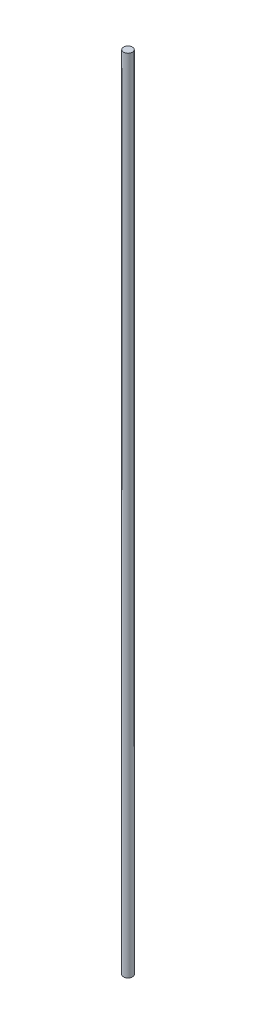
ISO-10303-21;
HEADER;
FILE_DESCRIPTION(('STEP AP214'),'2;1');
FILE_NAME('part.step','',(''),(''),'','','');
FILE_SCHEMA(('AUTOMOTIVE_DESIGN { 1 0 10303 214 1 1 1 1 }'));
ENDSEC;
DATA;
#1=APPLICATION_CONTEXT('core data for automotive mechanical design processes');
#2=APPLICATION_PROTOCOL_DEFINITION('international standard','automotive_design',2000,#1);
#3=PRODUCT_CONTEXT('',#1,'mechanical');
#4=PRODUCT('Part','Part','',(#3));
#5=PRODUCT_RELATED_PRODUCT_CATEGORY('part','',(#4));
#6=PRODUCT_DEFINITION_FORMATION('','',#4);
#7=PRODUCT_DEFINITION_CONTEXT('part definition',#1,'design');
#8=PRODUCT_DEFINITION('design','',#6,#7);
#9=PRODUCT_DEFINITION_SHAPE('','',#8);
#10=(LENGTH_UNIT() NAMED_UNIT(*) SI_UNIT(.MILLI.,.METRE.));
#11=(NAMED_UNIT(*) PLANE_ANGLE_UNIT() SI_UNIT($,.RADIAN.));
#12=(NAMED_UNIT(*) SI_UNIT($,.STERADIAN.) SOLID_ANGLE_UNIT());
#13=UNCERTAINTY_MEASURE_WITH_UNIT(LENGTH_MEASURE(1.E-05),#10,'distance_accuracy_value','');
#14=(GEOMETRIC_REPRESENTATION_CONTEXT(3) GLOBAL_UNCERTAINTY_ASSIGNED_CONTEXT((#13)) GLOBAL_UNIT_ASSIGNED_CONTEXT((#10,
#11,#12)) REPRESENTATION_CONTEXT('',''));
#15=CARTESIAN_POINT('',(0.,0.,0.));
#16=DIRECTION('',(0.,0.,1.));
#17=DIRECTION('',(1.,0.,0.));
#18=AXIS2_PLACEMENT_3D('',#15,#16,#17);
#19=CARTESIAN_POINT('',(0.,360.,0.));
#20=DIRECTION('',(0.,-1.,0.));
#21=DIRECTION('',(0.,0.,-1.));
#22=AXIS2_PLACEMENT_3D('',#19,#20,#21);
#23=CYLINDRICAL_SURFACE('',#22,2.);
#24=CARTESIAN_POINT('',(0.,360.,0.));
#25=DIRECTION('',(0.,1.,0.));
#26=DIRECTION('',(0.,0.,1.));
#27=AXIS2_PLACEMENT_3D('',#24,#25,#26);
#28=CIRCLE('',#27,2.);
#29=CARTESIAN_POINT('',(0.,360.,-2.));
#30=VERTEX_POINT('',#29);
#31=EDGE_CURVE('E10',#30,#30,#28,.T.);
#32=CARTESIAN_POINT('',(0.,0.,0.));
#33=DIRECTION('',(0.,1.,0.));
#34=DIRECTION('',(0.,0.,1.));
#35=AXIS2_PLACEMENT_3D('',#32,#33,#34);
#36=CIRCLE('',#35,2.);
#37=CARTESIAN_POINT('',(0.,0.,-2.));
#38=VERTEX_POINT('',#37);
#39=EDGE_CURVE('E46',#38,#38,#36,.T.);
#40=CARTESIAN_POINT('',(0.,360.,-2.));
#41=CARTESIAN_POINT('',(0.,356.25,-2.));
#42=CARTESIAN_POINT('',(0.,352.5,-2.));
#43=CARTESIAN_POINT('',(0.,345.,-2.));
#44=CARTESIAN_POINT('',(0.,341.25,-2.));
#45=CARTESIAN_POINT('',(0.,333.75,-2.));
#46=CARTESIAN_POINT('',(0.,330.,-2.));
#47=CARTESIAN_POINT('',(0.,322.5,-2.));
#48=CARTESIAN_POINT('',(0.,318.75,-2.));
#49=CARTESIAN_POINT('',(0.,311.25,-2.));
#50=CARTESIAN_POINT('',(0.,307.5,-2.));
#51=CARTESIAN_POINT('',(0.,300.,-2.));
#52=CARTESIAN_POINT('',(0.,296.25,-2.));
#53=CARTESIAN_POINT('',(0.,288.75,-2.));
#54=CARTESIAN_POINT('',(0.,285.,-2.));
#55=CARTESIAN_POINT('',(0.,277.5,-2.));
#56=CARTESIAN_POINT('',(0.,273.75,-2.));
#57=CARTESIAN_POINT('',(0.,266.25,-2.));
#58=CARTESIAN_POINT('',(0.,262.5,-2.));
#59=CARTESIAN_POINT('',(0.,255.,-2.));
#60=CARTESIAN_POINT('',(0.,251.25,-2.));
#61=CARTESIAN_POINT('',(0.,243.75,-2.));
#62=CARTESIAN_POINT('',(0.,240.,-2.));
#63=CARTESIAN_POINT('',(0.,232.5,-2.));
#64=CARTESIAN_POINT('',(0.,228.75,-2.));
#65=CARTESIAN_POINT('',(0.,221.25,-2.));
#66=CARTESIAN_POINT('',(0.,217.5,-2.));
#67=CARTESIAN_POINT('',(0.,210.,-2.));
#68=CARTESIAN_POINT('',(0.,206.25,-2.));
#69=CARTESIAN_POINT('',(0.,198.75,-2.));
#70=CARTESIAN_POINT('',(0.,195.,-2.));
#71=CARTESIAN_POINT('',(0.,187.5,-2.));
#72=CARTESIAN_POINT('',(0.,183.75,-2.));
#73=CARTESIAN_POINT('',(0.,176.25,-2.));
#74=CARTESIAN_POINT('',(0.,172.5,-2.));
#75=CARTESIAN_POINT('',(0.,165.,-2.));
#76=CARTESIAN_POINT('',(0.,161.25,-2.));
#77=CARTESIAN_POINT('',(0.,153.75,-2.));
#78=CARTESIAN_POINT('',(0.,150.,-2.));
#79=CARTESIAN_POINT('',(0.,142.5,-2.));
#80=CARTESIAN_POINT('',(0.,138.75,-2.));
#81=CARTESIAN_POINT('',(0.,131.25,-2.));
#82=CARTESIAN_POINT('',(0.,127.5,-2.));
#83=CARTESIAN_POINT('',(0.,120.,-2.));
#84=CARTESIAN_POINT('',(0.,116.25,-2.));
#85=CARTESIAN_POINT('',(0.,108.75,-2.));
#86=CARTESIAN_POINT('',(0.,105.,-2.));
#87=CARTESIAN_POINT('',(0.,97.5,-2.));
#88=CARTESIAN_POINT('',(0.,93.75,-2.));
#89=CARTESIAN_POINT('',(0.,86.25,-2.));
#90=CARTESIAN_POINT('',(0.,82.5,-2.));
#91=CARTESIAN_POINT('',(0.,75.,-2.));
#92=CARTESIAN_POINT('',(0.,71.25,-2.));
#93=CARTESIAN_POINT('',(0.,63.75,-2.));
#94=CARTESIAN_POINT('',(0.,60.,-2.));
#95=CARTESIAN_POINT('',(0.,52.5,-2.));
#96=CARTESIAN_POINT('',(0.,48.75,-2.));
#97=CARTESIAN_POINT('',(0.,41.25,-2.));
#98=CARTESIAN_POINT('',(0.,37.5,-2.));
#99=CARTESIAN_POINT('',(0.,30.,-2.));
#100=CARTESIAN_POINT('',(0.,26.25,-2.));
#101=CARTESIAN_POINT('',(0.,18.75,-2.));
#102=CARTESIAN_POINT('',(0.,14.9999999999999,-2.));
#103=CARTESIAN_POINT('',(0.,7.49999999999993,-2.));
#104=CARTESIAN_POINT('',(0.,3.74999999999994,-2.));
#105=CARTESIAN_POINT('',(0.,0.,-2.));
#106=B_SPLINE_CURVE_WITH_KNOTS('',3,(#40,#41,#42,#43,#44,#45,#46,#47,#48,#49,#50,#51,#52,#53,
#54,#55,#56,#57,#58,#59,#60,#61,#62,#63,#64,#65,#66,#67,#68,#69,#70,#71,#72,#73,#74,#75,#76,#77,
#78,#79,#80,#81,#82,#83,#84,#85,#86,#87,#88,#89,#90,#91,#92,#93,#94,#95,#96,#97,#98,#99,#100,
#101,#102,#103,#104,#105),.UNSPECIFIED.,.F.,.F.,(4,2,2,2,2,2,2,2,2,2,2,2,2,2,2,2,2,2,2,2,2,2,2,
2,2,2,2,2,2,2,2,2,4),(0.,11.25,22.5,33.7500000000001,45.,56.25,67.5,78.75,90.,101.25,112.5,
123.75,135.,146.25,157.5,168.75,180.,191.25,202.5,213.75,225.,236.25,247.5,258.75,270.,281.25,
292.5,303.75,315.,326.25,337.5,348.75,360.),.UNSPECIFIED.);
#107=EDGE_CURVE('BSEAM43',#30,#38,#106,.T.);
#108=ORIENTED_EDGE('',*,*,#31,.F.);
#109=ORIENTED_EDGE('',*,*,#39,.T.);
#110=ORIENTED_EDGE('',*,*,#107,.T.);
#111=ORIENTED_EDGE('',*,*,#107,.F.);
#112=EDGE_LOOP('',(#108,#110,#109,#111));
#113=FACE_BOUND('',#112,.T.);
#114=ADVANCED_FACE('F43',(#113),#23,.T.);
#115=CARTESIAN_POINT('',(0.,360.,0.));
#116=DIRECTION('',(0.,1.,0.));
#117=DIRECTION('',(0.,0.,1.));
#118=AXIS2_PLACEMENT_3D('',#115,#116,#117);
#119=PLANE('',#118);
#120=ORIENTED_EDGE('',*,*,#31,.T.);
#121=EDGE_LOOP('',(#120));
#122=FACE_BOUND('',#121,.T.);
#123=ADVANCED_FACE('F60',(#122),#119,.T.);
#124=CARTESIAN_POINT('',(0.,0.,0.));
#125=DIRECTION('',(0.,1.,0.));
#126=DIRECTION('',(0.,0.,1.));
#127=AXIS2_PLACEMENT_3D('',#124,#125,#126);
#128=PLANE('',#127);
#129=ORIENTED_EDGE('',*,*,#39,.F.);
#130=EDGE_LOOP('',(#129));
#131=FACE_BOUND('',#130,.T.);
#132=ADVANCED_FACE('F58',(#131),#128,.F.);
#133=CLOSED_SHELL('',(#114,#123,#132));
#134=MANIFOLD_SOLID_BREP('B2',#133);
#135=ADVANCED_BREP_SHAPE_REPRESENTATION('',(#18,#134),#14);
#136=SHAPE_DEFINITION_REPRESENTATION(#9,#135);
ENDSEC;
END-ISO-10303-21;
